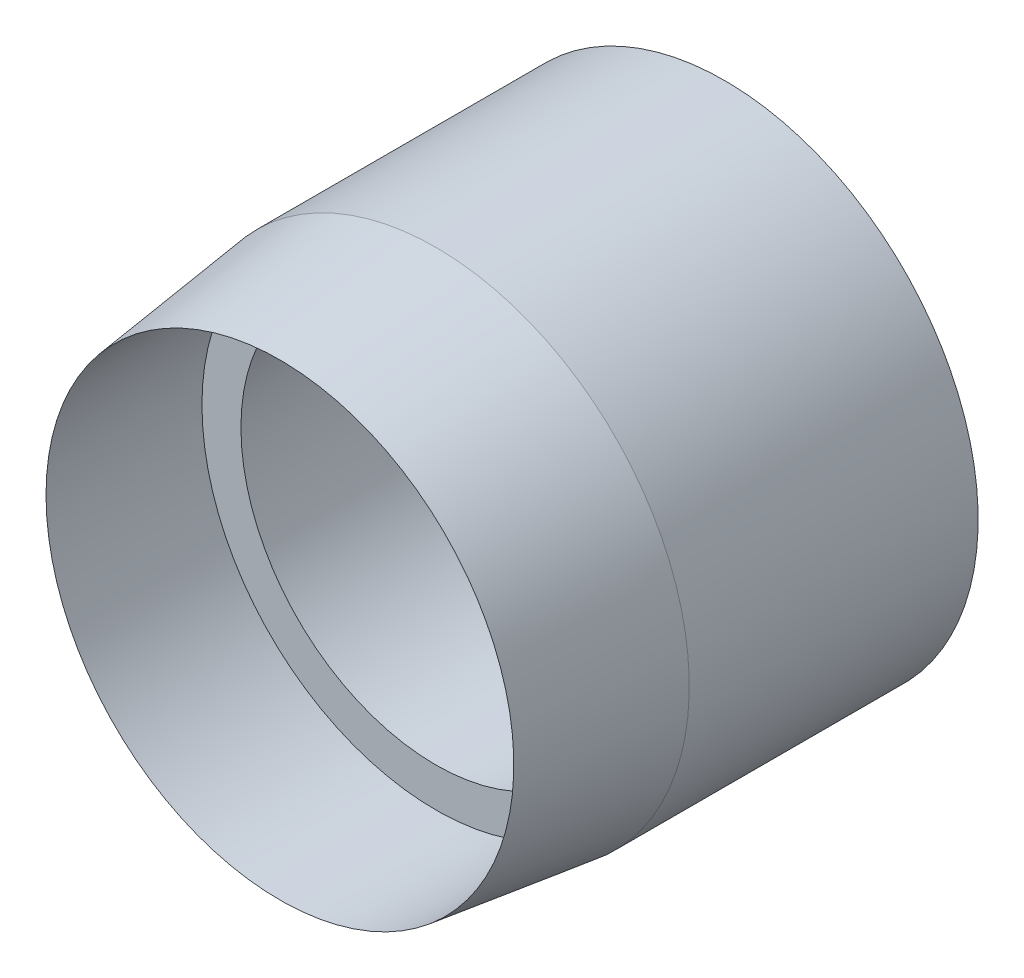
ISO-10303-21;
HEADER;
FILE_DESCRIPTION(('STEP AP214'),'2;1');
FILE_NAME('part.step','',(''),(''),'','','');
FILE_SCHEMA(('AUTOMOTIVE_DESIGN { 1 0 10303 214 1 1 1 1 }'));
ENDSEC;
DATA;
#1=APPLICATION_CONTEXT('core data for automotive mechanical design processes');
#2=APPLICATION_PROTOCOL_DEFINITION('international standard','automotive_design',2000,#1);
#3=PRODUCT_CONTEXT('',#1,'mechanical');
#4=PRODUCT('Part','Part','',(#3));
#5=PRODUCT_RELATED_PRODUCT_CATEGORY('part','',(#4));
#6=PRODUCT_DEFINITION_FORMATION('','',#4);
#7=PRODUCT_DEFINITION_CONTEXT('part definition',#1,'design');
#8=PRODUCT_DEFINITION('design','',#6,#7);
#9=PRODUCT_DEFINITION_SHAPE('','',#8);
#10=(LENGTH_UNIT() NAMED_UNIT(*) SI_UNIT(.MILLI.,.METRE.));
#11=(NAMED_UNIT(*) PLANE_ANGLE_UNIT() SI_UNIT($,.RADIAN.));
#12=(NAMED_UNIT(*) SI_UNIT($,.STERADIAN.) SOLID_ANGLE_UNIT());
#13=UNCERTAINTY_MEASURE_WITH_UNIT(LENGTH_MEASURE(1.E-05),#10,'distance_accuracy_value','');
#14=(GEOMETRIC_REPRESENTATION_CONTEXT(3) GLOBAL_UNCERTAINTY_ASSIGNED_CONTEXT((#13)) GLOBAL_UNIT_ASSIGNED_CONTEXT((#10,
#11,#12)) REPRESENTATION_CONTEXT('',''));
#15=CARTESIAN_POINT('',(0.,0.,0.));
#16=DIRECTION('',(0.,0.,1.));
#17=DIRECTION('',(1.,0.,0.));
#18=AXIS2_PLACEMENT_3D('',#15,#16,#17);
#19=CARTESIAN_POINT('',(0.,0.,0.));
#20=DIRECTION('',(0.,0.,-1.));
#21=DIRECTION('',(-1.,0.,0.));
#22=AXIS2_PLACEMENT_3D('',#19,#20,#21);
#23=CYLINDRICAL_SURFACE('',#22,63.5);
#24=CARTESIAN_POINT('',(0.,0.,94.1086075949367));
#25=DIRECTION('',(0.,0.,-1.));
#26=DIRECTION('',(-1.,0.,0.));
#27=AXIS2_PLACEMENT_3D('',#24,#25,#26);
#28=CIRCLE('',#27,63.5);
#29=CARTESIAN_POINT('',(-63.5,0.,94.1086075949367));
#30=VERTEX_POINT('',#29);
#31=EDGE_CURVE('E61',#30,#30,#28,.T.);
#32=ORIENTED_EDGE('',*,*,#31,.F.);
#33=EDGE_LOOP('',(#32));
#34=FACE_BOUND('',#33,.T.);
#35=CARTESIAN_POINT('',(0.,0.,0.));
#36=DIRECTION('',(0.,0.,-1.));
#37=DIRECTION('',(-1.,0.,0.));
#38=AXIS2_PLACEMENT_3D('',#35,#36,#37);
#39=CIRCLE('',#38,63.5);
#40=CARTESIAN_POINT('',(-63.5,0.,0.));
#41=VERTEX_POINT('',#40);
#42=EDGE_CURVE('E10',#41,#41,#39,.T.);
#43=ORIENTED_EDGE('',*,*,#42,.T.);
#44=EDGE_LOOP('',(#43));
#45=FACE_BOUND('',#44,.T.);
#46=ADVANCED_FACE('F39',(#34,#45),#23,.F.);
#47=CARTESIAN_POINT('',(0.,-63.5,0.));
#48=DIRECTION('',(0.,0.,1.));
#49=DIRECTION('',(1.,0.,0.));
#50=AXIS2_PLACEMENT_3D('',#47,#48,#49);
#51=PLANE('',#50);
#52=ORIENTED_EDGE('',*,*,#42,.F.);
#53=EDGE_LOOP('',(#52));
#54=FACE_BOUND('',#53,.T.);
#55=CARTESIAN_POINT('',(0.,0.,0.));
#56=DIRECTION('',(0.,0.,-1.));
#57=DIRECTION('',(-1.,0.,0.));
#58=AXIS2_PLACEMENT_3D('',#55,#56,#57);
#59=CIRCLE('',#58,82.55);
#60=CARTESIAN_POINT('',(-82.55,0.,0.));
#61=VERTEX_POINT('',#60);
#62=EDGE_CURVE('E45',#61,#61,#59,.T.);
#63=ORIENTED_EDGE('',*,*,#62,.T.);
#64=EDGE_LOOP('',(#63));
#65=FACE_BOUND('',#64,.T.);
#66=ADVANCED_FACE('F68',(#54,#65),#51,.F.);
#67=CARTESIAN_POINT('',(0.,0.,0.));
#68=DIRECTION('',(0.,0.,-1.));
#69=DIRECTION('',(-1.,0.,0.));
#70=AXIS2_PLACEMENT_3D('',#67,#68,#69);
#71=CYLINDRICAL_SURFACE('',#70,82.55);
#72=ORIENTED_EDGE('',*,*,#62,.F.);
#73=EDGE_LOOP('',(#72));
#74=FACE_BOUND('',#73,.T.);
#75=CARTESIAN_POINT('',(0.,0.,94.1086075949367));
#76=DIRECTION('',(0.,0.,-1.));
#77=DIRECTION('',(-1.,0.,0.));
#78=AXIS2_PLACEMENT_3D('',#75,#76,#77);
#79=CIRCLE('',#78,82.55);
#80=CARTESIAN_POINT('',(-82.55,0.,94.1086075949367));
#81=VERTEX_POINT('',#80);
#82=EDGE_CURVE('E49',#81,#81,#79,.T.);
#83=ORIENTED_EDGE('',*,*,#82,.T.);
#84=EDGE_LOOP('',(#83));
#85=FACE_BOUND('',#84,.T.);
#86=ADVANCED_FACE('F72',(#74,#85),#71,.T.);
#87=CARTESIAN_POINT('',(0.,0.,144.908607594937));
#88=DIRECTION('',(0.,0.,-1.));
#89=DIRECTION('',(-1.,0.,0.));
#90=AXIS2_PLACEMENT_3D('',#87,#88,#89);
#91=CONICAL_SURFACE('',#90,76.2,0.124354994546761);
#92=ORIENTED_EDGE('',*,*,#82,.F.);
#93=EDGE_LOOP('',(#92));
#94=FACE_BOUND('',#93,.T.);
#95=CARTESIAN_POINT('',(0.,0.,144.908607594937));
#96=DIRECTION('',(0.,0.,-1.));
#97=DIRECTION('',(-1.,0.,0.));
#98=AXIS2_PLACEMENT_3D('',#95,#96,#97);
#99=CIRCLE('',#98,76.2);
#100=CARTESIAN_POINT('',(-76.2,0.,144.908607594937));
#101=VERTEX_POINT('',#100);
#102=EDGE_CURVE('E53',#101,#101,#99,.T.);
#103=ORIENTED_EDGE('',*,*,#102,.T.);
#104=EDGE_LOOP('',(#103));
#105=FACE_BOUND('',#104,.T.);
#106=ADVANCED_FACE('F77',(#94,#105),#91,.T.);
#107=CARTESIAN_POINT('',(0.,0.,0.));
#108=DIRECTION('',(0.,0.,-1.));
#109=DIRECTION('',(-1.,0.,0.));
#110=AXIS2_PLACEMENT_3D('',#107,#108,#109);
#111=CYLINDRICAL_SURFACE('',#110,76.2);
#112=ORIENTED_EDGE('',*,*,#102,.F.);
#113=EDGE_LOOP('',(#112));
#114=FACE_BOUND('',#113,.T.);
#115=CARTESIAN_POINT('',(0.,0.,94.1086075949367));
#116=DIRECTION('',(0.,0.,-1.));
#117=DIRECTION('',(-1.,0.,0.));
#118=AXIS2_PLACEMENT_3D('',#115,#116,#117);
#119=CIRCLE('',#118,76.2);
#120=CARTESIAN_POINT('',(-76.2,0.,94.1086075949367));
#121=VERTEX_POINT('',#120);
#122=EDGE_CURVE('E58',#121,#121,#119,.T.);
#123=ORIENTED_EDGE('',*,*,#122,.T.);
#124=EDGE_LOOP('',(#123));
#125=FACE_BOUND('',#124,.T.);
#126=ADVANCED_FACE('F83',(#114,#125),#111,.F.);
#127=CARTESIAN_POINT('',(0.,-76.2,94.1086075949367));
#128=DIRECTION('',(0.,0.,-1.));
#129=DIRECTION('',(-1.,0.,0.));
#130=AXIS2_PLACEMENT_3D('',#127,#128,#129);
#131=PLANE('',#130);
#132=ORIENTED_EDGE('',*,*,#122,.F.);
#133=EDGE_LOOP('',(#132));
#134=FACE_BOUND('',#133,.T.);
#135=ORIENTED_EDGE('',*,*,#31,.T.);
#136=EDGE_LOOP('',(#135));
#137=FACE_BOUND('',#136,.T.);
#138=ADVANCED_FACE('F65',(#134,#137),#131,.F.);
#139=CLOSED_SHELL('',(#46,#66,#86,#106,#126,#138));
#140=MANIFOLD_SOLID_BREP('B2',#139);
#141=ADVANCED_BREP_SHAPE_REPRESENTATION('',(#18,#140),#14);
#142=SHAPE_DEFINITION_REPRESENTATION(#9,#141);
ENDSEC;
END-ISO-10303-21;
